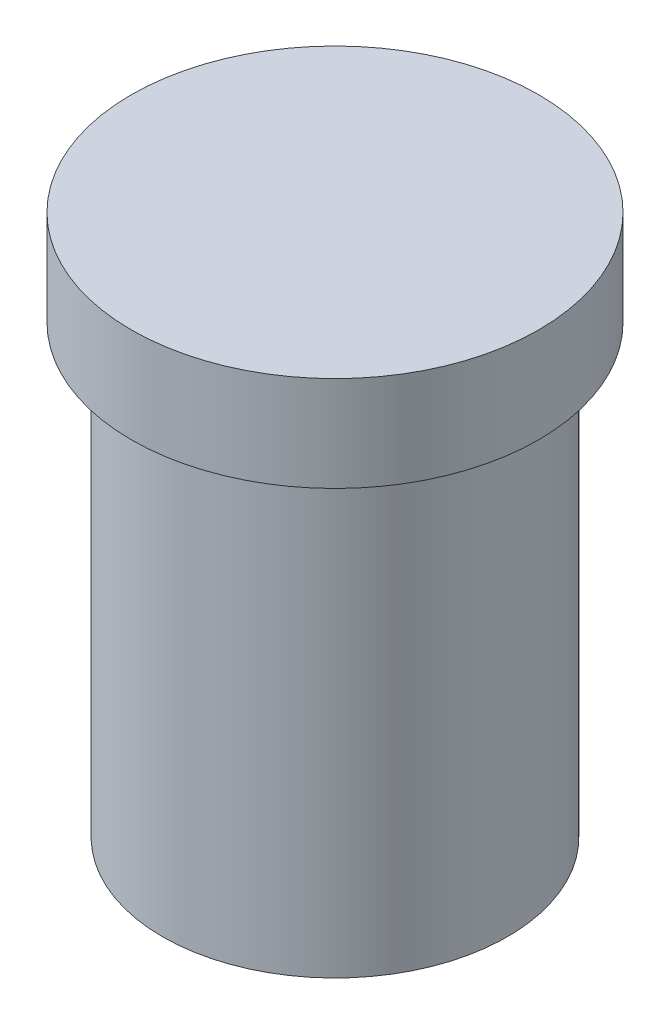
ISO-10303-21;
HEADER;
FILE_DESCRIPTION(('STEP AP214'),'2;1');
FILE_NAME('part.step','',(''),(''),'','','');
FILE_SCHEMA(('AUTOMOTIVE_DESIGN { 1 0 10303 214 1 1 1 1 }'));
ENDSEC;
DATA;
#1=APPLICATION_CONTEXT('core data for automotive mechanical design processes');
#2=APPLICATION_PROTOCOL_DEFINITION('international standard','automotive_design',2000,#1);
#3=PRODUCT_CONTEXT('',#1,'mechanical');
#4=PRODUCT('Part','Part','',(#3));
#5=PRODUCT_RELATED_PRODUCT_CATEGORY('part','',(#4));
#6=PRODUCT_DEFINITION_FORMATION('','',#4);
#7=PRODUCT_DEFINITION_CONTEXT('part definition',#1,'design');
#8=PRODUCT_DEFINITION('design','',#6,#7);
#9=PRODUCT_DEFINITION_SHAPE('','',#8);
#10=(LENGTH_UNIT() NAMED_UNIT(*) SI_UNIT(.MILLI.,.METRE.));
#11=(NAMED_UNIT(*) PLANE_ANGLE_UNIT() SI_UNIT($,.RADIAN.));
#12=(NAMED_UNIT(*) SI_UNIT($,.STERADIAN.) SOLID_ANGLE_UNIT());
#13=UNCERTAINTY_MEASURE_WITH_UNIT(LENGTH_MEASURE(1.E-05),#10,'distance_accuracy_value','');
#14=(GEOMETRIC_REPRESENTATION_CONTEXT(3) GLOBAL_UNCERTAINTY_ASSIGNED_CONTEXT((#13)) GLOBAL_UNIT_ASSIGNED_CONTEXT((#10,
#11,#12)) REPRESENTATION_CONTEXT('',''));
#15=CARTESIAN_POINT('',(0.,0.,0.));
#16=DIRECTION('',(0.,0.,1.));
#17=DIRECTION('',(1.,0.,0.));
#18=AXIS2_PLACEMENT_3D('',#15,#16,#17);
#19=CARTESIAN_POINT('',(0.,3.2,0.));
#20=DIRECTION('',(0.,-1.,0.));
#21=DIRECTION('',(0.,0.,-1.));
#22=AXIS2_PLACEMENT_3D('',#19,#20,#21);
#23=CYLINDRICAL_SURFACE('',#22,6.85);
#24=CARTESIAN_POINT('',(0.,3.2,0.));
#25=DIRECTION('',(0.,1.,0.));
#26=DIRECTION('',(0.,0.,1.));
#27=AXIS2_PLACEMENT_3D('',#24,#25,#26);
#28=CIRCLE('',#27,6.85);
#29=CARTESIAN_POINT('',(0.,3.2,6.85));
#30=VERTEX_POINT('',#29);
#31=EDGE_CURVE('E39',#30,#30,#28,.T.);
#32=ORIENTED_EDGE('',*,*,#31,.F.);
#33=EDGE_LOOP('',(#32));
#34=FACE_BOUND('',#33,.T.);
#35=CARTESIAN_POINT('',(0.,0.,0.));
#36=DIRECTION('',(0.,1.,0.));
#37=DIRECTION('',(0.,0.,1.));
#38=AXIS2_PLACEMENT_3D('',#35,#36,#37);
#39=CIRCLE('',#38,6.85);
#40=CARTESIAN_POINT('',(0.,0.,6.85));
#41=VERTEX_POINT('',#40);
#42=EDGE_CURVE('E35',#41,#41,#39,.T.);
#43=ORIENTED_EDGE('',*,*,#42,.T.);
#44=EDGE_LOOP('',(#43));
#45=FACE_BOUND('',#44,.T.);
#46=ADVANCED_FACE('F32',(#34,#45),#23,.T.);
#47=CARTESIAN_POINT('',(0.,3.2,0.));
#48=DIRECTION('',(0.,1.,0.));
#49=DIRECTION('',(0.,0.,1.));
#50=AXIS2_PLACEMENT_3D('',#47,#48,#49);
#51=PLANE('',#50);
#52=ORIENTED_EDGE('',*,*,#31,.T.);
#53=EDGE_LOOP('',(#52));
#54=FACE_BOUND('',#53,.T.);
#55=ADVANCED_FACE('F56',(#54),#51,.T.);
#56=CARTESIAN_POINT('',(0.,0.,0.));
#57=DIRECTION('',(0.,1.,0.));
#58=DIRECTION('',(0.,0.,1.));
#59=AXIS2_PLACEMENT_3D('',#56,#57,#58);
#60=PLANE('',#59);
#61=CARTESIAN_POINT('',(0.,0.,0.));
#62=DIRECTION('',(0.,-1.,0.));
#63=DIRECTION('',(0.,0.,-1.));
#64=AXIS2_PLACEMENT_3D('',#61,#62,#63);
#65=CIRCLE('',#64,5.8);
#66=CARTESIAN_POINT('',(0.,0.,-5.8));
#67=VERTEX_POINT('',#66);
#68=EDGE_CURVE('E10',#67,#67,#65,.T.);
#69=ORIENTED_EDGE('',*,*,#68,.F.);
#70=EDGE_LOOP('',(#69));
#71=FACE_BOUND('',#70,.T.);
#72=ORIENTED_EDGE('',*,*,#42,.F.);
#73=EDGE_LOOP('',(#72));
#74=FACE_BOUND('',#73,.T.);
#75=ADVANCED_FACE('F53',(#71,#74),#60,.F.);
#76=CARTESIAN_POINT('',(0.,-15.,0.));
#77=DIRECTION('',(0.,1.,0.));
#78=DIRECTION('',(0.,0.,1.));
#79=AXIS2_PLACEMENT_3D('',#76,#77,#78);
#80=CYLINDRICAL_SURFACE('',#79,5.8);
#81=CARTESIAN_POINT('',(0.,-15.,0.));
#82=DIRECTION('',(0.,-1.,0.));
#83=DIRECTION('',(0.,0.,-1.));
#84=AXIS2_PLACEMENT_3D('',#81,#82,#83);
#85=CIRCLE('',#84,5.8);
#86=CARTESIAN_POINT('',(0.,-15.,-5.8));
#87=VERTEX_POINT('',#86);
#88=EDGE_CURVE('E45',#87,#87,#85,.T.);
#89=ORIENTED_EDGE('',*,*,#88,.F.);
#90=EDGE_LOOP('',(#89));
#91=FACE_BOUND('',#90,.T.);
#92=ORIENTED_EDGE('',*,*,#68,.T.);
#93=EDGE_LOOP('',(#92));
#94=FACE_BOUND('',#93,.T.);
#95=ADVANCED_FACE('F55',(#91,#94),#80,.T.);
#96=CARTESIAN_POINT('',(0.,-15.,0.));
#97=DIRECTION('',(0.,-1.,0.));
#98=DIRECTION('',(0.,0.,-1.));
#99=AXIS2_PLACEMENT_3D('',#96,#97,#98);
#100=PLANE('',#99);
#101=ORIENTED_EDGE('',*,*,#88,.T.);
#102=EDGE_LOOP('',(#101));
#103=FACE_BOUND('',#102,.T.);
#104=ADVANCED_FACE('F62',(#103),#100,.T.);
#105=CLOSED_SHELL('',(#46,#55,#75,#95,#104));
#106=MANIFOLD_SOLID_BREP('B2',#105);
#107=ADVANCED_BREP_SHAPE_REPRESENTATION('',(#18,#106),#14);
#108=SHAPE_DEFINITION_REPRESENTATION(#9,#107);
ENDSEC;
END-ISO-10303-21;
